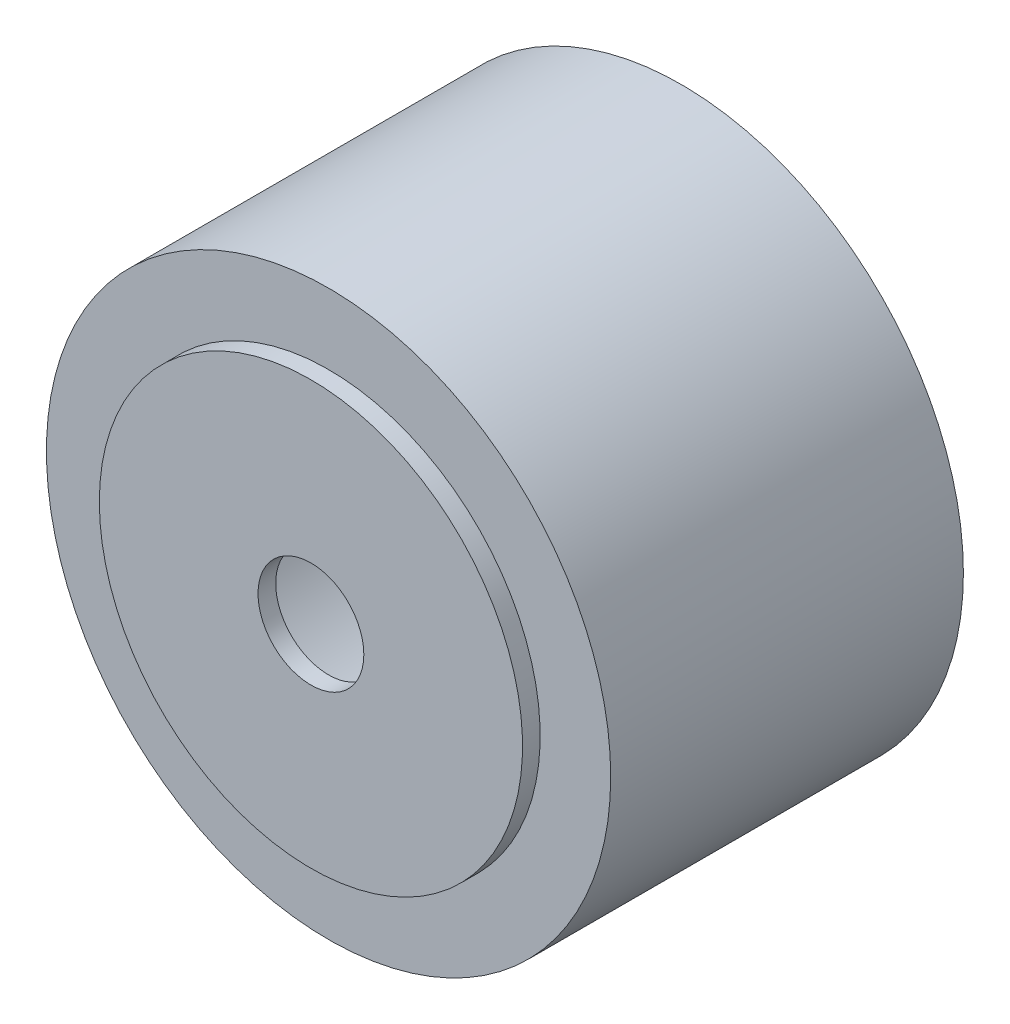
ISO-10303-21;
HEADER;
FILE_DESCRIPTION(('STEP AP214'),'2;1');
FILE_NAME('part.step','',(''),(''),'','','');
FILE_SCHEMA(('AUTOMOTIVE_DESIGN { 1 0 10303 214 1 1 1 1 }'));
ENDSEC;
DATA;
#1=APPLICATION_CONTEXT('core data for automotive mechanical design processes');
#2=APPLICATION_PROTOCOL_DEFINITION('international standard','automotive_design',2000,#1);
#3=PRODUCT_CONTEXT('',#1,'mechanical');
#4=PRODUCT('Part','Part','',(#3));
#5=PRODUCT_RELATED_PRODUCT_CATEGORY('part','',(#4));
#6=PRODUCT_DEFINITION_FORMATION('','',#4);
#7=PRODUCT_DEFINITION_CONTEXT('part definition',#1,'design');
#8=PRODUCT_DEFINITION('design','',#6,#7);
#9=PRODUCT_DEFINITION_SHAPE('','',#8);
#10=(LENGTH_UNIT() NAMED_UNIT(*) SI_UNIT(.MILLI.,.METRE.));
#11=(NAMED_UNIT(*) PLANE_ANGLE_UNIT() SI_UNIT($,.RADIAN.));
#12=(NAMED_UNIT(*) SI_UNIT($,.STERADIAN.) SOLID_ANGLE_UNIT());
#13=UNCERTAINTY_MEASURE_WITH_UNIT(LENGTH_MEASURE(1.E-05),#10,'distance_accuracy_value','');
#14=(GEOMETRIC_REPRESENTATION_CONTEXT(3) GLOBAL_UNCERTAINTY_ASSIGNED_CONTEXT((#13)) GLOBAL_UNIT_ASSIGNED_CONTEXT((#10,
#11,#12)) REPRESENTATION_CONTEXT('',''));
#15=CARTESIAN_POINT('',(0.,0.,0.));
#16=DIRECTION('',(0.,0.,1.));
#17=DIRECTION('',(1.,0.,0.));
#18=AXIS2_PLACEMENT_3D('',#15,#16,#17);
#19=CARTESIAN_POINT('',(0.,0.,21.));
#20=DIRECTION('',(0.,0.,-1.));
#21=DIRECTION('',(-1.,0.,0.));
#22=AXIS2_PLACEMENT_3D('',#19,#20,#21);
#23=CYLINDRICAL_SURFACE('',#22,10.);
#24=CARTESIAN_POINT('',(0.,0.,-1.));
#25=DIRECTION('',(0.,0.,-1.));
#26=DIRECTION('',(-1.,0.,0.));
#27=AXIS2_PLACEMENT_3D('',#24,#25,#26);
#28=CIRCLE('',#27,10.);
#29=CARTESIAN_POINT('',(-10.,0.,-1.));
#30=VERTEX_POINT('',#29);
#31=EDGE_CURVE('E58',#30,#30,#28,.T.);
#32=CARTESIAN_POINT('',(0.,0.,20.));
#33=DIRECTION('',(0.,0.,1.));
#34=DIRECTION('',(1.,0.,0.));
#35=AXIS2_PLACEMENT_3D('',#32,#33,#34);
#36=CIRCLE('',#35,10.);
#37=CARTESIAN_POINT('',(-10.,0.,20.));
#38=VERTEX_POINT('',#37);
#39=EDGE_CURVE('E61',#38,#38,#36,.T.);
#40=CARTESIAN_POINT('',(-10.,0.,-1.));
#41=CARTESIAN_POINT('',(-10.,0.,-0.781250000000001));
#42=CARTESIAN_POINT('',(-10.,0.,-0.5625));
#43=CARTESIAN_POINT('',(-10.,0.,-0.125));
#44=CARTESIAN_POINT('',(-10.,0.,0.0937500000000001));
#45=CARTESIAN_POINT('',(-10.,0.,0.53125));
#46=CARTESIAN_POINT('',(-10.,0.,0.750000000000001));
#47=CARTESIAN_POINT('',(-10.,0.,1.1875));
#48=CARTESIAN_POINT('',(-10.,0.,1.40625));
#49=CARTESIAN_POINT('',(-10.,0.,1.84375));
#50=CARTESIAN_POINT('',(-10.,0.,2.0625));
#51=CARTESIAN_POINT('',(-10.,0.,2.5));
#52=CARTESIAN_POINT('',(-10.,0.,2.71875));
#53=CARTESIAN_POINT('',(-10.,0.,3.15625));
#54=CARTESIAN_POINT('',(-10.,0.,3.375));
#55=CARTESIAN_POINT('',(-10.,0.,3.8125));
#56=CARTESIAN_POINT('',(-10.,0.,4.03125));
#57=CARTESIAN_POINT('',(-10.,0.,4.46875));
#58=CARTESIAN_POINT('',(-10.,0.,4.6875));
#59=CARTESIAN_POINT('',(-10.,0.,5.125));
#60=CARTESIAN_POINT('',(-10.,0.,5.34375));
#61=CARTESIAN_POINT('',(-10.,0.,5.78125));
#62=CARTESIAN_POINT('',(-10.,0.,6.));
#63=CARTESIAN_POINT('',(-10.,0.,6.4375));
#64=CARTESIAN_POINT('',(-10.,0.,6.65625));
#65=CARTESIAN_POINT('',(-10.,0.,7.09375));
#66=CARTESIAN_POINT('',(-10.,0.,7.3125));
#67=CARTESIAN_POINT('',(-10.,0.,7.75));
#68=CARTESIAN_POINT('',(-10.,0.,7.96875));
#69=CARTESIAN_POINT('',(-10.,0.,8.40625));
#70=CARTESIAN_POINT('',(-10.,0.,8.625));
#71=CARTESIAN_POINT('',(-10.,0.,9.0625));
#72=CARTESIAN_POINT('',(-10.,0.,9.28125));
#73=CARTESIAN_POINT('',(-10.,0.,9.71875));
#74=CARTESIAN_POINT('',(-10.,0.,9.9375));
#75=CARTESIAN_POINT('',(-10.,0.,10.375));
#76=CARTESIAN_POINT('',(-10.,0.,10.59375));
#77=CARTESIAN_POINT('',(-10.,0.,11.03125));
#78=CARTESIAN_POINT('',(-10.,0.,11.25));
#79=CARTESIAN_POINT('',(-10.,0.,11.6875));
#80=CARTESIAN_POINT('',(-10.,0.,11.90625));
#81=CARTESIAN_POINT('',(-10.,0.,12.34375));
#82=CARTESIAN_POINT('',(-10.,0.,12.5625));
#83=CARTESIAN_POINT('',(-10.,0.,13.));
#84=CARTESIAN_POINT('',(-10.,0.,13.21875));
#85=CARTESIAN_POINT('',(-10.,0.,13.65625));
#86=CARTESIAN_POINT('',(-10.,0.,13.875));
#87=CARTESIAN_POINT('',(-10.,0.,14.3125));
#88=CARTESIAN_POINT('',(-10.,0.,14.53125));
#89=CARTESIAN_POINT('',(-10.,0.,14.96875));
#90=CARTESIAN_POINT('',(-10.,0.,15.1875));
#91=CARTESIAN_POINT('',(-10.,0.,15.625));
#92=CARTESIAN_POINT('',(-10.,0.,15.84375));
#93=CARTESIAN_POINT('',(-10.,0.,16.28125));
#94=CARTESIAN_POINT('',(-10.,0.,16.5));
#95=CARTESIAN_POINT('',(-10.,0.,16.9375));
#96=CARTESIAN_POINT('',(-10.,0.,17.15625));
#97=CARTESIAN_POINT('',(-10.,0.,17.59375));
#98=CARTESIAN_POINT('',(-10.,0.,17.8125));
#99=CARTESIAN_POINT('',(-10.,0.,18.25));
#100=CARTESIAN_POINT('',(-10.,0.,18.46875));
#101=CARTESIAN_POINT('',(-10.,0.,18.90625));
#102=CARTESIAN_POINT('',(-10.,0.,19.125));
#103=CARTESIAN_POINT('',(-10.,0.,19.5625));
#104=CARTESIAN_POINT('',(-10.,0.,19.78125));
#105=CARTESIAN_POINT('',(-10.,0.,20.));
#106=B_SPLINE_CURVE_WITH_KNOTS('',3,(#40,#41,#42,#43,#44,#45,#46,#47,#48,#49,#50,#51,#52,#53,
#54,#55,#56,#57,#58,#59,#60,#61,#62,#63,#64,#65,#66,#67,#68,#69,#70,#71,#72,#73,#74,#75,#76,#77,
#78,#79,#80,#81,#82,#83,#84,#85,#86,#87,#88,#89,#90,#91,#92,#93,#94,#95,#96,#97,#98,#99,#100,
#101,#102,#103,#104,#105),.UNSPECIFIED.,.F.,.F.,(4,2,2,2,2,2,2,2,2,2,2,2,2,2,2,2,2,2,2,2,2,2,2,
2,2,2,2,2,2,2,2,2,4),(0.,0.656250000000001,1.3125,1.96875,2.625,3.28125,3.9375,4.59375,5.25,
5.90625,6.5625,7.21875,7.875,8.53125,9.1875,9.84375,10.5,11.15625,11.8125,12.46875,13.125,
13.78125,14.4375,15.09375,15.75,16.40625,17.0625,17.71875,18.375,19.03125,19.6875,20.34375,21.),.UNSPECIFIED.);
#107=EDGE_CURVE('BSEAM32',#30,#38,#106,.T.);
#108=ORIENTED_EDGE('',*,*,#31,.T.);
#109=ORIENTED_EDGE('',*,*,#39,.T.);
#110=ORIENTED_EDGE('',*,*,#107,.T.);
#111=ORIENTED_EDGE('',*,*,#107,.F.);
#112=EDGE_LOOP('',(#108,#110,#109,#111));
#113=FACE_BOUND('',#112,.T.);
#114=ADVANCED_FACE('F32',(#113),#23,.F.);
#115=CARTESIAN_POINT('',(0.,0.,0.));
#116=DIRECTION('',(0.,0.,1.));
#117=DIRECTION('',(1.,0.,0.));
#118=AXIS2_PLACEMENT_3D('',#115,#116,#117);
#119=PLANE('',#118);
#120=CARTESIAN_POINT('',(0.,0.,0.));
#121=DIRECTION('',(0.,0.,1.));
#122=DIRECTION('',(1.,0.,0.));
#123=AXIS2_PLACEMENT_3D('',#120,#121,#122);
#124=CIRCLE('',#123,16.);
#125=CARTESIAN_POINT('',(16.,0.,0.));
#126=VERTEX_POINT('',#125);
#127=EDGE_CURVE('E43',#126,#126,#124,.T.);
#128=ORIENTED_EDGE('',*,*,#127,.F.);
#129=EDGE_LOOP('',(#128));
#130=FACE_BOUND('',#129,.T.);
#131=CARTESIAN_POINT('',(0.,0.,0.));
#132=DIRECTION('',(0.,0.,1.));
#133=DIRECTION('',(1.,0.,0.));
#134=AXIS2_PLACEMENT_3D('',#131,#132,#133);
#135=CIRCLE('',#134,12.);
#136=CARTESIAN_POINT('',(12.,0.,0.));
#137=VERTEX_POINT('',#136);
#138=EDGE_CURVE('E10',#137,#137,#135,.F.);
#139=ORIENTED_EDGE('',*,*,#138,.F.);
#140=EDGE_LOOP('',(#139));
#141=FACE_BOUND('',#140,.T.);
#142=ADVANCED_FACE('F96',(#130,#141),#119,.F.);
#143=CARTESIAN_POINT('',(0.,0.,20.));
#144=DIRECTION('',(0.,0.,1.));
#145=DIRECTION('',(1.,0.,0.));
#146=AXIS2_PLACEMENT_3D('',#143,#144,#145);
#147=PLANE('',#146);
#148=CARTESIAN_POINT('',(0.,0.,20.));
#149=DIRECTION('',(0.,0.,1.));
#150=DIRECTION('',(1.,0.,0.));
#151=AXIS2_PLACEMENT_3D('',#148,#149,#150);
#152=CIRCLE('',#151,16.);
#153=CARTESIAN_POINT('',(16.,0.,20.));
#154=VERTEX_POINT('',#153);
#155=EDGE_CURVE('E39',#154,#154,#152,.T.);
#156=ORIENTED_EDGE('',*,*,#155,.T.);
#157=EDGE_LOOP('',(#156));
#158=FACE_BOUND('',#157,.T.);
#159=CARTESIAN_POINT('',(0.,0.,20.));
#160=DIRECTION('',(0.,0.,1.));
#161=DIRECTION('',(1.,0.,0.));
#162=AXIS2_PLACEMENT_3D('',#159,#160,#161);
#163=CIRCLE('',#162,12.);
#164=CARTESIAN_POINT('',(-12.,0.,20.));
#165=VERTEX_POINT('',#164);
#166=EDGE_CURVE('E48',#165,#165,#163,.T.);
#167=ORIENTED_EDGE('',*,*,#166,.F.);
#168=EDGE_LOOP('',(#167));
#169=FACE_BOUND('',#168,.T.);
#170=ADVANCED_FACE('F92',(#158,#169),#147,.T.);
#171=CARTESIAN_POINT('',(0.,0.,20.));
#172=DIRECTION('',(0.,0.,-1.));
#173=DIRECTION('',(-1.,0.,0.));
#174=AXIS2_PLACEMENT_3D('',#171,#172,#173);
#175=CYLINDRICAL_SURFACE('',#174,16.);
#176=ORIENTED_EDGE('',*,*,#155,.F.);
#177=EDGE_LOOP('',(#176));
#178=FACE_BOUND('',#177,.T.);
#179=ORIENTED_EDGE('',*,*,#127,.T.);
#180=EDGE_LOOP('',(#179));
#181=FACE_BOUND('',#180,.T.);
#182=ADVANCED_FACE('F34',(#178,#181),#175,.T.);
#183=CARTESIAN_POINT('',(0.,0.,21.));
#184=DIRECTION('',(0.,0.,1.));
#185=DIRECTION('',(1.,0.,0.));
#186=AXIS2_PLACEMENT_3D('',#183,#184,#185);
#187=PLANE('',#186);
#188=CARTESIAN_POINT('',(0.,0.,21.));
#189=DIRECTION('',(0.,0.,1.));
#190=DIRECTION('',(1.,0.,0.));
#191=AXIS2_PLACEMENT_3D('',#188,#189,#190);
#192=CIRCLE('',#191,12.);
#193=CARTESIAN_POINT('',(-12.,0.,21.));
#194=VERTEX_POINT('',#193);
#195=EDGE_CURVE('E52',#194,#194,#192,.T.);
#196=ORIENTED_EDGE('',*,*,#195,.T.);
#197=EDGE_LOOP('',(#196));
#198=FACE_BOUND('',#197,.T.);
#199=CARTESIAN_POINT('',(0.,0.,21.));
#200=DIRECTION('',(0.,0.,1.));
#201=DIRECTION('',(1.,0.,0.));
#202=AXIS2_PLACEMENT_3D('',#199,#200,#201);
#203=CIRCLE('',#202,3.);
#204=CARTESIAN_POINT('',(3.,0.,21.));
#205=VERTEX_POINT('',#204);
#206=EDGE_CURVE('E65',#205,#205,#203,.T.);
#207=ORIENTED_EDGE('',*,*,#206,.F.);
#208=EDGE_LOOP('',(#207));
#209=FACE_BOUND('',#208,.T.);
#210=ADVANCED_FACE('F80',(#198,#209),#187,.T.);
#211=CARTESIAN_POINT('',(0.,0.,21.));
#212=DIRECTION('',(0.,0.,-1.));
#213=DIRECTION('',(-1.,0.,0.));
#214=AXIS2_PLACEMENT_3D('',#211,#212,#213);
#215=CYLINDRICAL_SURFACE('',#214,12.);
#216=CARTESIAN_POINT('',(-12.,0.,20.));
#217=CARTESIAN_POINT('',(-12.,0.,20.0104166666667));
#218=CARTESIAN_POINT('',(-12.,0.,20.0208333333333));
#219=CARTESIAN_POINT('',(-12.,0.,20.0416666666667));
#220=CARTESIAN_POINT('',(-12.,0.,20.0520833333333));
#221=CARTESIAN_POINT('',(-12.,0.,20.0729166666667));
#222=CARTESIAN_POINT('',(-12.,0.,20.0833333333333));
#223=CARTESIAN_POINT('',(-12.,0.,20.1041666666667));
#224=CARTESIAN_POINT('',(-12.,0.,20.1145833333333));
#225=CARTESIAN_POINT('',(-12.,0.,20.1354166666667));
#226=CARTESIAN_POINT('',(-12.,0.,20.1458333333333));
#227=CARTESIAN_POINT('',(-12.,0.,20.1666666666667));
#228=CARTESIAN_POINT('',(-12.,0.,20.1770833333333));
#229=CARTESIAN_POINT('',(-12.,0.,20.1979166666667));
#230=CARTESIAN_POINT('',(-12.,0.,20.2083333333333));
#231=CARTESIAN_POINT('',(-12.,0.,20.2291666666667));
#232=CARTESIAN_POINT('',(-12.,0.,20.2395833333333));
#233=CARTESIAN_POINT('',(-12.,0.,20.2604166666667));
#234=CARTESIAN_POINT('',(-12.,0.,20.2708333333333));
#235=CARTESIAN_POINT('',(-12.,0.,20.2916666666667));
#236=CARTESIAN_POINT('',(-12.,0.,20.3020833333333));
#237=CARTESIAN_POINT('',(-12.,0.,20.3229166666667));
#238=CARTESIAN_POINT('',(-12.,0.,20.3333333333333));
#239=CARTESIAN_POINT('',(-12.,0.,20.3541666666667));
#240=CARTESIAN_POINT('',(-12.,0.,20.3645833333333));
#241=CARTESIAN_POINT('',(-12.,0.,20.3854166666667));
#242=CARTESIAN_POINT('',(-12.,0.,20.3958333333333));
#243=CARTESIAN_POINT('',(-12.,0.,20.4166666666667));
#244=CARTESIAN_POINT('',(-12.,0.,20.4270833333333));
#245=CARTESIAN_POINT('',(-12.,0.,20.4479166666667));
#246=CARTESIAN_POINT('',(-12.,0.,20.4583333333333));
#247=CARTESIAN_POINT('',(-12.,0.,20.4791666666667));
#248=CARTESIAN_POINT('',(-12.,0.,20.4895833333333));
#249=CARTESIAN_POINT('',(-12.,0.,20.5104166666667));
#250=CARTESIAN_POINT('',(-12.,0.,20.5208333333333));
#251=CARTESIAN_POINT('',(-12.,0.,20.5416666666667));
#252=CARTESIAN_POINT('',(-12.,0.,20.5520833333333));
#253=CARTESIAN_POINT('',(-12.,0.,20.5729166666667));
#254=CARTESIAN_POINT('',(-12.,0.,20.5833333333333));
#255=CARTESIAN_POINT('',(-12.,0.,20.6041666666667));
#256=CARTESIAN_POINT('',(-12.,0.,20.6145833333333));
#257=CARTESIAN_POINT('',(-12.,0.,20.6354166666667));
#258=CARTESIAN_POINT('',(-12.,0.,20.6458333333333));
#259=CARTESIAN_POINT('',(-12.,0.,20.6666666666667));
#260=CARTESIAN_POINT('',(-12.,0.,20.6770833333333));
#261=CARTESIAN_POINT('',(-12.,0.,20.6979166666667));
#262=CARTESIAN_POINT('',(-12.,0.,20.7083333333333));
#263=CARTESIAN_POINT('',(-12.,0.,20.7291666666667));
#264=CARTESIAN_POINT('',(-12.,0.,20.7395833333333));
#265=CARTESIAN_POINT('',(-12.,0.,20.7604166666667));
#266=CARTESIAN_POINT('',(-12.,0.,20.7708333333333));
#267=CARTESIAN_POINT('',(-12.,0.,20.7916666666667));
#268=CARTESIAN_POINT('',(-12.,0.,20.8020833333333));
#269=CARTESIAN_POINT('',(-12.,0.,20.8229166666667));
#270=CARTESIAN_POINT('',(-12.,0.,20.8333333333333));
#271=CARTESIAN_POINT('',(-12.,0.,20.8541666666667));
#272=CARTESIAN_POINT('',(-12.,0.,20.8645833333333));
#273=CARTESIAN_POINT('',(-12.,0.,20.8854166666667));
#274=CARTESIAN_POINT('',(-12.,0.,20.8958333333333));
#275=CARTESIAN_POINT('',(-12.,0.,20.9166666666667));
#276=CARTESIAN_POINT('',(-12.,0.,20.9270833333333));
#277=CARTESIAN_POINT('',(-12.,0.,20.9479166666667));
#278=CARTESIAN_POINT('',(-12.,0.,20.9583333333333));
#279=CARTESIAN_POINT('',(-12.,0.,20.9791666666667));
#280=CARTESIAN_POINT('',(-12.,0.,20.9895833333333));
#281=CARTESIAN_POINT('',(-12.,0.,21.));
#282=B_SPLINE_CURVE_WITH_KNOTS('',3,(#216,#217,#218,#219,#220,#221,#222,#223,#224,#225,#226,
#227,#228,#229,#230,#231,#232,#233,#234,#235,#236,#237,#238,#239,#240,#241,#242,#243,#244,#245,
#246,#247,#248,#249,#250,#251,#252,#253,#254,#255,#256,#257,#258,#259,#260,#261,#262,#263,#264,
#265,#266,#267,#268,#269,#270,#271,#272,#273,#274,#275,#276,#277,#278,#279,#280,#281),
.UNSPECIFIED.,.F.,.F.,(4,2,2,2,2,2,2,2,2,2,2,2,2,2,2,2,2,2,2,2,2,2,2,2,2,2,2,2,2,2,2,2,4),(0.,
0.03125,0.0625000000000001,0.0937500000000001,0.125,0.15625,0.1875,0.21875,0.25,0.28125,0.3125,
0.34375,0.375,0.40625,0.4375,0.46875,0.5,0.53125,0.5625,0.593750000000001,0.625000000000001,
0.656250000000001,0.687500000000001,0.718750000000001,0.750000000000001,0.781250000000001,
0.812500000000001,0.843750000000001,0.875000000000004,0.906250000000004,0.937500000000004,
0.968750000000004,1.),.UNSPECIFIED.);
#283=EDGE_CURVE('BSEAM82',#165,#194,#282,.T.);
#284=ORIENTED_EDGE('',*,*,#166,.T.);
#285=ORIENTED_EDGE('',*,*,#195,.F.);
#286=ORIENTED_EDGE('',*,*,#283,.T.);
#287=ORIENTED_EDGE('',*,*,#283,.F.);
#288=EDGE_LOOP('',(#284,#286,#285,#287));
#289=FACE_BOUND('',#288,.T.);
#290=ADVANCED_FACE('F82',(#289),#215,.T.);
#291=CARTESIAN_POINT('',(0.,0.,-1.));
#292=DIRECTION('',(0.,0.,-1.));
#293=DIRECTION('',(-1.,0.,0.));
#294=AXIS2_PLACEMENT_3D('',#291,#292,#293);
#295=PLANE('',#294);
#296=CARTESIAN_POINT('',(0.,0.,-1.));
#297=DIRECTION('',(0.,0.,-1.));
#298=DIRECTION('',(-1.,0.,0.));
#299=AXIS2_PLACEMENT_3D('',#296,#297,#298);
#300=CIRCLE('',#299,12.);
#301=CARTESIAN_POINT('',(-12.,0.,-1.));
#302=VERTEX_POINT('',#301);
#303=EDGE_CURVE('E55',#302,#302,#300,.T.);
#304=ORIENTED_EDGE('',*,*,#303,.T.);
#305=EDGE_LOOP('',(#304));
#306=FACE_BOUND('',#305,.T.);
#307=ORIENTED_EDGE('',*,*,#31,.F.);
#308=EDGE_LOOP('',(#307));
#309=FACE_BOUND('',#308,.T.);
#310=ADVANCED_FACE('F89',(#306,#309),#295,.T.);
#311=CARTESIAN_POINT('',(0.,0.,-1.));
#312=DIRECTION('',(0.,0.,1.));
#313=DIRECTION('',(1.,0.,0.));
#314=AXIS2_PLACEMENT_3D('',#311,#312,#313);
#315=CYLINDRICAL_SURFACE('',#314,12.);
#316=ORIENTED_EDGE('',*,*,#303,.F.);
#317=EDGE_LOOP('',(#316));
#318=FACE_BOUND('',#317,.T.);
#319=ORIENTED_EDGE('',*,*,#138,.T.);
#320=EDGE_LOOP('',(#319));
#321=FACE_BOUND('',#320,.T.);
#322=ADVANCED_FACE('F104',(#318,#321),#315,.T.);
#323=CARTESIAN_POINT('',(0.,0.,20.));
#324=DIRECTION('',(0.,0.,1.));
#325=DIRECTION('',(1.,0.,0.));
#326=AXIS2_PLACEMENT_3D('',#323,#324,#325);
#327=PLANE('',#326);
#328=CARTESIAN_POINT('',(0.,0.,20.));
#329=DIRECTION('',(0.,0.,1.));
#330=DIRECTION('',(1.,0.,0.));
#331=AXIS2_PLACEMENT_3D('',#328,#329,#330);
#332=CIRCLE('',#331,3.);
#333=CARTESIAN_POINT('',(3.,0.,20.));
#334=VERTEX_POINT('',#333);
#335=EDGE_CURVE('E64',#334,#334,#332,.T.);
#336=ORIENTED_EDGE('',*,*,#335,.T.);
#337=EDGE_LOOP('',(#336));
#338=FACE_BOUND('',#337,.T.);
#339=ORIENTED_EDGE('',*,*,#39,.F.);
#340=EDGE_LOOP('',(#339));
#341=FACE_BOUND('',#340,.T.);
#342=ADVANCED_FACE('F71',(#338,#341),#327,.F.);
#343=CARTESIAN_POINT('',(0.,0.,20.));
#344=DIRECTION('',(0.,0.,1.));
#345=DIRECTION('',(1.,0.,0.));
#346=AXIS2_PLACEMENT_3D('',#343,#344,#345);
#347=CYLINDRICAL_SURFACE('',#346,3.);
#348=ORIENTED_EDGE('',*,*,#335,.F.);
#349=EDGE_LOOP('',(#348));
#350=FACE_BOUND('',#349,.T.);
#351=ORIENTED_EDGE('',*,*,#206,.T.);
#352=EDGE_LOOP('',(#351));
#353=FACE_BOUND('',#352,.T.);
#354=ADVANCED_FACE('F74',(#350,#353),#347,.F.);
#355=CLOSED_SHELL('',(#114,#142,#170,#182,#210,#290,#310,#322,#342,#354));
#356=MANIFOLD_SOLID_BREP('B2',#355);
#357=ADVANCED_BREP_SHAPE_REPRESENTATION('',(#18,#356),#14);
#358=SHAPE_DEFINITION_REPRESENTATION(#9,#357);
ENDSEC;
END-ISO-10303-21;
